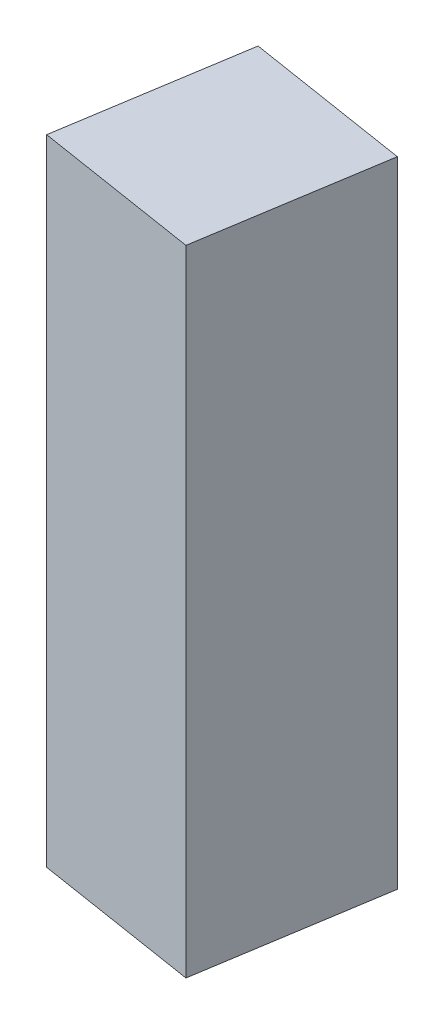
ISO-10303-21;
HEADER;
FILE_DESCRIPTION(('STEP AP214'),'2;1');
FILE_NAME('part.step','',(''),(''),'','','');
FILE_SCHEMA(('AUTOMOTIVE_DESIGN { 1 0 10303 214 1 1 1 1 }'));
ENDSEC;
DATA;
#1=APPLICATION_CONTEXT('core data for automotive mechanical design processes');
#2=APPLICATION_PROTOCOL_DEFINITION('international standard','automotive_design',2000,#1);
#3=PRODUCT_CONTEXT('',#1,'mechanical');
#4=PRODUCT('Part','Part','',(#3));
#5=PRODUCT_RELATED_PRODUCT_CATEGORY('part','',(#4));
#6=PRODUCT_DEFINITION_FORMATION('','',#4);
#7=PRODUCT_DEFINITION_CONTEXT('part definition',#1,'design');
#8=PRODUCT_DEFINITION('design','',#6,#7);
#9=PRODUCT_DEFINITION_SHAPE('','',#8);
#10=(LENGTH_UNIT() NAMED_UNIT(*) SI_UNIT(.MILLI.,.METRE.));
#11=(NAMED_UNIT(*) PLANE_ANGLE_UNIT() SI_UNIT($,.RADIAN.));
#12=(NAMED_UNIT(*) SI_UNIT($,.STERADIAN.) SOLID_ANGLE_UNIT());
#13=UNCERTAINTY_MEASURE_WITH_UNIT(LENGTH_MEASURE(1.E-05),#10,'distance_accuracy_value','');
#14=(GEOMETRIC_REPRESENTATION_CONTEXT(3) GLOBAL_UNCERTAINTY_ASSIGNED_CONTEXT((#13)) GLOBAL_UNIT_ASSIGNED_CONTEXT((#10,
#11,#12)) REPRESENTATION_CONTEXT('',''));
#15=CARTESIAN_POINT('',(0.,0.,0.));
#16=DIRECTION('',(0.,0.,1.));
#17=DIRECTION('',(1.,0.,0.));
#18=AXIS2_PLACEMENT_3D('',#15,#16,#17);
#19=CARTESIAN_POINT('',(105.1434954276,41.8789091554,102.4713523848));
#20=DIRECTION('',(0.156434479727333,0.,-0.987688338268929));
#21=DIRECTION('',(-0.987688338268929,0.,-0.156434479727333));
#22=AXIS2_PLACEMENT_3D('',#19,#20,#21);
#23=PLANE('',#22);
#24=DIRECTION('',(0.987688338268929,0.,0.156434479727333));
#25=VECTOR('',#24,1.);
#26=CARTESIAN_POINT('',(104.4962696583,46.8419278552,102.3688418837));
#27=LINE('',#26,#25);
#28=CARTESIAN_POINT('',(103.849043889,46.8419278552,102.2663313826));
#29=VERTEX_POINT('',#28);
#30=CARTESIAN_POINT('',(105.1434954276,46.8419278552,102.4713523848));
#31=VERTEX_POINT('',#30);
#32=EDGE_CURVE('E61',#29,#31,#27,.T.);
#33=ORIENTED_EDGE('',*,*,#32,.T.);
#34=DIRECTION('',(0.,1.,0.));
#35=VECTOR('',#34,1.);
#36=CARTESIAN_POINT('',(105.1434954276,44.3604185053,102.4713523848));
#37=LINE('',#36,#35);
#38=CARTESIAN_POINT('',(105.143495437221,41.8789091554,102.47135238378));
#39=VERTEX_POINT('',#38);
#40=EDGE_CURVE('E81',#39,#31,#37,.T.);
#41=ORIENTED_EDGE('',*,*,#40,.F.);
#42=DIRECTION('',(-0.987688338268929,0.,-0.156434479727333));
#43=VECTOR('',#42,1.);
#44=CARTESIAN_POINT('',(104.4962696583,41.8789091554,102.3688418837));
#45=LINE('',#44,#43);
#46=CARTESIAN_POINT('',(103.849043893039,41.8789091554,102.266331392898));
#47=VERTEX_POINT('',#46);
#48=EDGE_CURVE('E84',#39,#47,#45,.T.);
#49=ORIENTED_EDGE('',*,*,#48,.T.);
#50=DIRECTION('',(0.,-1.,0.));
#51=VECTOR('',#50,1.);
#52=CARTESIAN_POINT('',(103.849043889,44.3604185053,102.2663313826));
#53=LINE('',#52,#51);
#54=EDGE_CURVE('E65',#29,#47,#53,.T.);
#55=ORIENTED_EDGE('',*,*,#54,.F.);
#56=EDGE_LOOP('',(#33,#41,#49,#55));
#57=FACE_BOUND('',#56,.T.);
#58=ADVANCED_FACE('F17',(#57),#23,.T.);
#59=CARTESIAN_POINT('',(104.9173836116,41.8789091554,103.898966192));
#60=DIRECTION('',(0.987688340365625,0.,0.156434466489317));
#61=DIRECTION('',(0.156434466489317,0.,-0.987688340365625));
#62=AXIS2_PLACEMENT_3D('',#59,#60,#61);
#63=PLANE('',#62);
#64=DIRECTION('',(-0.156434466489317,0.,0.987688340365625));
#65=VECTOR('',#64,1.);
#66=CARTESIAN_POINT('',(105.0304395196,46.8419278552,103.1851592884));
#67=LINE('',#66,#65);
#68=CARTESIAN_POINT('',(104.9173836116,46.8419278552,103.898966192));
#69=VERTEX_POINT('',#68);
#70=EDGE_CURVE('E78',#31,#69,#67,.T.);
#71=ORIENTED_EDGE('',*,*,#70,.T.);
#72=DIRECTION('',(0.,1.,0.));
#73=VECTOR('',#72,1.);
#74=CARTESIAN_POINT('',(104.9173836116,44.3604185053,103.898966192));
#75=LINE('',#74,#73);
#76=CARTESIAN_POINT('',(104.917383611376,41.8789091554,103.898966193412));
#77=VERTEX_POINT('',#76);
#78=EDGE_CURVE('E73',#77,#69,#75,.T.);
#79=ORIENTED_EDGE('',*,*,#78,.F.);
#80=DIRECTION('',(0.156434466489317,0.,-0.987688340365625));
#81=VECTOR('',#80,1.);
#82=CARTESIAN_POINT('',(105.0304395196,41.8789091554,103.1851592884));
#83=LINE('',#82,#81);
#84=EDGE_CURVE('E31',#77,#39,#83,.T.);
#85=ORIENTED_EDGE('',*,*,#84,.T.);
#86=ORIENTED_EDGE('',*,*,#40,.T.);
#87=EDGE_LOOP('',(#71,#79,#85,#86));
#88=FACE_BOUND('',#87,.T.);
#89=ADVANCED_FACE('F89',(#88),#63,.T.);
#90=CARTESIAN_POINT('',(103.849043889,46.8419278552,102.2663313826));
#91=DIRECTION('',(0.,-1.,0.));
#92=DIRECTION('',(0.987688338268929,0.,0.156434479727333));
#93=AXIS2_PLACEMENT_3D('',#90,#91,#92);
#94=PLANE('',#93);
#95=ORIENTED_EDGE('',*,*,#32,.F.);
#96=DIRECTION('',(0.156434463774111,0.,-0.987688340795671));
#97=VECTOR('',#96,1.);
#98=CARTESIAN_POINT('',(103.735987981,46.8419278552,102.9801382989));
#99=LINE('',#98,#97);
#100=CARTESIAN_POINT('',(103.622932073,46.8419278552,103.6939452152));
#101=VERTEX_POINT('',#100);
#102=EDGE_CURVE('E54',#101,#29,#99,.T.);
#103=ORIENTED_EDGE('',*,*,#102,.F.);
#104=DIRECTION('',(-0.9876883412634,0.,-0.156434460820989));
#105=VECTOR('',#104,1.);
#106=CARTESIAN_POINT('',(104.2701578423,46.8419278552,103.7964557036));
#107=LINE('',#106,#105);
#108=EDGE_CURVE('E59',#69,#101,#107,.T.);
#109=ORIENTED_EDGE('',*,*,#108,.F.);
#110=ORIENTED_EDGE('',*,*,#70,.F.);
#111=EDGE_LOOP('',(#95,#103,#109,#110));
#112=FACE_BOUND('',#111,.T.);
#113=ADVANCED_FACE('F56',(#112),#94,.F.);
#114=CARTESIAN_POINT('',(103.849043889,41.8789091554,102.2663313826));
#115=DIRECTION('',(-0.987688340795671,0.,-0.156434463774111));
#116=DIRECTION('',(-0.156434463774111,0.,0.987688340795671));
#117=AXIS2_PLACEMENT_3D('',#114,#115,#116);
#118=PLANE('',#117);
#119=ORIENTED_EDGE('',*,*,#102,.T.);
#120=ORIENTED_EDGE('',*,*,#54,.T.);
#121=DIRECTION('',(-0.156434463774111,0.,0.987688340795671));
#122=VECTOR('',#121,1.);
#123=CARTESIAN_POINT('',(103.735987981,41.8789091554,102.9801382989));
#124=LINE('',#123,#122);
#125=CARTESIAN_POINT('',(103.622932072918,41.8789091554,103.693945215719));
#126=VERTEX_POINT('',#125);
#127=EDGE_CURVE('E66',#47,#126,#124,.T.);
#128=ORIENTED_EDGE('',*,*,#127,.T.);
#129=DIRECTION('',(0.,-1.,0.));
#130=VECTOR('',#129,1.);
#131=CARTESIAN_POINT('',(103.622932073,44.3604185053,103.6939452152));
#132=LINE('',#131,#130);
#133=EDGE_CURVE('E26',#101,#126,#132,.T.);
#134=ORIENTED_EDGE('',*,*,#133,.F.);
#135=EDGE_LOOP('',(#119,#120,#128,#134));
#136=FACE_BOUND('',#135,.T.);
#137=ADVANCED_FACE('F69',(#136),#118,.T.);
#138=CARTESIAN_POINT('',(103.622932073,41.8789091554,103.6939452152));
#139=DIRECTION('',(-0.156434460820989,0.,0.9876883412634));
#140=DIRECTION('',(0.9876883412634,0.,0.156434460820989));
#141=AXIS2_PLACEMENT_3D('',#138,#139,#140);
#142=PLANE('',#141);
#143=ORIENTED_EDGE('',*,*,#108,.T.);
#144=ORIENTED_EDGE('',*,*,#133,.T.);
#145=DIRECTION('',(-0.987688341047529,0.,-0.156434462183943));
#146=VECTOR('',#145,1.);
#147=CARTESIAN_POINT('',(104.917383628794,41.8789091554,103.898966197619));
#148=LINE('',#147,#146);
#149=EDGE_CURVE('E11',#77,#126,#148,.T.);
#150=ORIENTED_EDGE('',*,*,#149,.F.);
#151=ORIENTED_EDGE('',*,*,#78,.T.);
#152=EDGE_LOOP('',(#143,#144,#150,#151));
#153=FACE_BOUND('',#152,.T.);
#154=ADVANCED_FACE('F72',(#153),#142,.T.);
#155=CARTESIAN_POINT('',(103.6138086978,41.8789091554,103.9087620068));
#156=DIRECTION('',(0.,-1.,0.));
#157=DIRECTION('',(0.,0.,-1.));
#158=AXIS2_PLACEMENT_3D('',#155,#156,#157);
#159=PLANE('',#158);
#160=ORIENTED_EDGE('',*,*,#84,.F.);
#161=ORIENTED_EDGE('',*,*,#149,.T.);
#162=ORIENTED_EDGE('',*,*,#127,.F.);
#163=ORIENTED_EDGE('',*,*,#48,.F.);
#164=EDGE_LOOP('',(#160,#161,#162,#163));
#165=FACE_BOUND('',#164,.T.);
#166=ADVANCED_FACE('F19',(#165),#159,.T.);
#167=CLOSED_SHELL('',(#58,#89,#113,#137,#154,#166));
#168=MANIFOLD_SOLID_BREP('B1',#167);
#169=ADVANCED_BREP_SHAPE_REPRESENTATION('',(#18,#168),#14);
#170=SHAPE_DEFINITION_REPRESENTATION(#9,#169);
ENDSEC;
END-ISO-10303-21;
